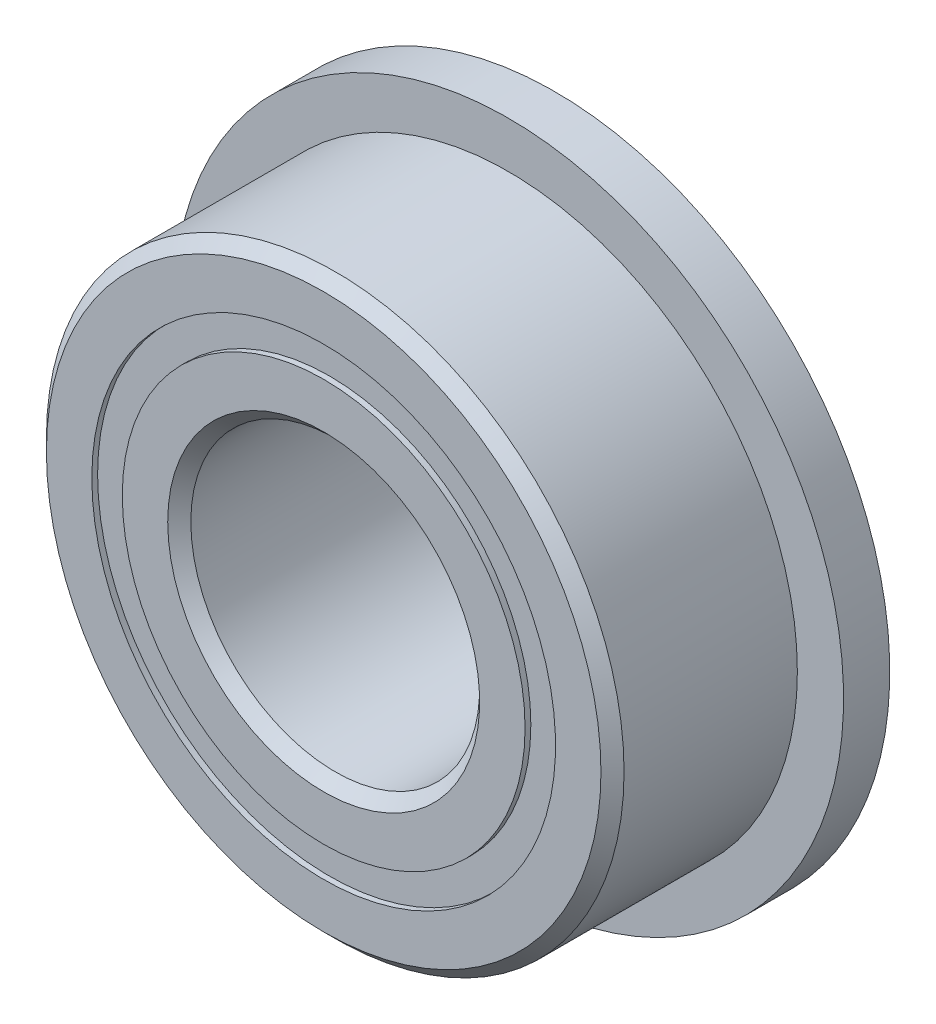
ISO-10303-21;
HEADER;
FILE_DESCRIPTION(('STEP AP214'),'2;1');
FILE_NAME('part.step','',(''),(''),'','','');
FILE_SCHEMA(('AUTOMOTIVE_DESIGN { 1 0 10303 214 1 1 1 1 }'));
ENDSEC;
DATA;
#1=APPLICATION_CONTEXT('core data for automotive mechanical design processes');
#2=APPLICATION_PROTOCOL_DEFINITION('international standard','automotive_design',2000,#1);
#3=PRODUCT_CONTEXT('',#1,'mechanical');
#4=PRODUCT('Part','Part','',(#3));
#5=PRODUCT_RELATED_PRODUCT_CATEGORY('part','',(#4));
#6=PRODUCT_DEFINITION_FORMATION('','',#4);
#7=PRODUCT_DEFINITION_CONTEXT('part definition',#1,'design');
#8=PRODUCT_DEFINITION('design','',#6,#7);
#9=PRODUCT_DEFINITION_SHAPE('','',#8);
#10=(LENGTH_UNIT() NAMED_UNIT(*) SI_UNIT(.MILLI.,.METRE.));
#11=(NAMED_UNIT(*) PLANE_ANGLE_UNIT() SI_UNIT($,.RADIAN.));
#12=(NAMED_UNIT(*) SI_UNIT($,.STERADIAN.) SOLID_ANGLE_UNIT());
#13=UNCERTAINTY_MEASURE_WITH_UNIT(LENGTH_MEASURE(1.E-05),#10,'distance_accuracy_value','');
#14=(GEOMETRIC_REPRESENTATION_CONTEXT(3) GLOBAL_UNCERTAINTY_ASSIGNED_CONTEXT((#13)) GLOBAL_UNIT_ASSIGNED_CONTEXT((#10,
#11,#12)) REPRESENTATION_CONTEXT('',''));
#15=CARTESIAN_POINT('',(0.,0.,0.));
#16=DIRECTION('',(0.,0.,1.));
#17=DIRECTION('',(1.,0.,0.));
#18=AXIS2_PLACEMENT_3D('',#15,#16,#17);
#19=CARTESIAN_POINT('',(0.,4.01373626379225,-1.99999999995271));
#20=DIRECTION('',(0.,0.,-1.));
#21=DIRECTION('',(-1.,0.,0.));
#22=AXIS2_PLACEMENT_3D('',#19,#20,#21);
#23=PLANE('',#22);
#24=CARTESIAN_POINT('',(0.,0.,-1.9999999999527));
#25=DIRECTION('',(0.,0.,-1.));
#26=DIRECTION('',(-1.,0.,0.));
#27=AXIS2_PLACEMENT_3D('',#24,#25,#26);
#28=CIRCLE('',#27,5.80000000019813);
#29=CARTESIAN_POINT('',(-5.80000000019813,0.,-1.9999999999527));
#30=VERTEX_POINT('',#29);
#31=EDGE_CURVE('E12',#30,#30,#28,.T.);
#32=ORIENTED_EDGE('',*,*,#31,.T.);
#33=EDGE_LOOP('',(#32));
#34=FACE_BOUND('',#33,.T.);
#35=CARTESIAN_POINT('',(0.,0.,-1.99999999995271));
#36=DIRECTION('',(0.,0.,-1.));
#37=DIRECTION('',(-1.,0.,0.));
#38=AXIS2_PLACEMENT_3D('',#35,#36,#37);
#39=CIRCLE('',#38,4.01373626379225);
#40=CARTESIAN_POINT('',(-4.01373626379225,0.,-1.99999999995271));
#41=VERTEX_POINT('',#40);
#42=EDGE_CURVE('E118',#41,#41,#39,.T.);
#43=ORIENTED_EDGE('',*,*,#42,.F.);
#44=EDGE_LOOP('',(#43));
#45=FACE_BOUND('',#44,.T.);
#46=ADVANCED_FACE('F45',(#34,#45),#23,.T.);
#47=CARTESIAN_POINT('',(0.,0.,0.));
#48=DIRECTION('',(0.,0.,-1.));
#49=DIRECTION('',(-1.,0.,0.));
#50=AXIS2_PLACEMENT_3D('',#47,#48,#49);
#51=CYLINDRICAL_SURFACE('',#50,5.80000000019813);
#52=CARTESIAN_POINT('',(0.,0.,-1.1999999999724));
#53=DIRECTION('',(0.,0.,-1.));
#54=DIRECTION('',(-1.,0.,0.));
#55=AXIS2_PLACEMENT_3D('',#52,#53,#54);
#56=CIRCLE('',#55,5.80000000019813);
#57=CARTESIAN_POINT('',(-5.80000000019813,0.,-1.1999999999724));
#58=VERTEX_POINT('',#57);
#59=EDGE_CURVE('E53',#58,#58,#56,.T.);
#60=ORIENTED_EDGE('',*,*,#59,.T.);
#61=EDGE_LOOP('',(#60));
#62=FACE_BOUND('',#61,.T.);
#63=ORIENTED_EDGE('',*,*,#31,.F.);
#64=EDGE_LOOP('',(#63));
#65=FACE_BOUND('',#64,.T.);
#66=ADVANCED_FACE('F262',(#62,#65),#51,.T.);
#67=CARTESIAN_POINT('',(0.,5.80000000019813,-1.1999999999724));
#68=DIRECTION('',(0.,0.,1.));
#69=DIRECTION('',(1.,0.,0.));
#70=AXIS2_PLACEMENT_3D('',#67,#68,#69);
#71=PLANE('',#70);
#72=CARTESIAN_POINT('',(0.,0.,-1.1999999999724));
#73=DIRECTION('',(0.,0.,-1.));
#74=DIRECTION('',(-1.,0.,0.));
#75=AXIS2_PLACEMENT_3D('',#72,#73,#74);
#76=CIRCLE('',#75,5.00000000019813);
#77=CARTESIAN_POINT('',(-5.00000000019813,0.,-1.1999999999724));
#78=VERTEX_POINT('',#77);
#79=EDGE_CURVE('E59',#78,#78,#76,.T.);
#80=ORIENTED_EDGE('',*,*,#79,.T.);
#81=EDGE_LOOP('',(#80));
#82=FACE_BOUND('',#81,.T.);
#83=ORIENTED_EDGE('',*,*,#59,.F.);
#84=EDGE_LOOP('',(#83));
#85=FACE_BOUND('',#84,.T.);
#86=ADVANCED_FACE('F259',(#82,#85),#71,.T.);
#87=CARTESIAN_POINT('',(0.,0.,0.));
#88=DIRECTION('',(0.,0.,-1.));
#89=DIRECTION('',(-1.,0.,0.));
#90=AXIS2_PLACEMENT_3D('',#87,#88,#89);
#91=CYLINDRICAL_SURFACE('',#90,5.00000000019813);
#92=CARTESIAN_POINT('',(0.,0.,1.79999999997417));
#93=DIRECTION('',(0.,0.,-1.));
#94=DIRECTION('',(-1.,0.,0.));
#95=AXIS2_PLACEMENT_3D('',#92,#93,#94);
#96=CIRCLE('',#95,5.00000000019813);
#97=CARTESIAN_POINT('',(-5.00000000019813,0.,1.79999999997417));
#98=VERTEX_POINT('',#97);
#99=EDGE_CURVE('E65',#98,#98,#96,.T.);
#100=ORIENTED_EDGE('',*,*,#99,.T.);
#101=EDGE_LOOP('',(#100));
#102=FACE_BOUND('',#101,.T.);
#103=ORIENTED_EDGE('',*,*,#79,.F.);
#104=EDGE_LOOP('',(#103));
#105=FACE_BOUND('',#104,.T.);
#106=ADVANCED_FACE('F255',(#102,#105),#91,.T.);
#107=CARTESIAN_POINT('',(0.,0.,1.79999999997417));
#108=DIRECTION('',(0.,0.,-1.));
#109=DIRECTION('',(-1.,0.,0.));
#110=AXIS2_PLACEMENT_3D('',#107,#108,#109);
#111=CONICAL_SURFACE('',#110,5.00000000019813,0.785398163397455);
#112=CARTESIAN_POINT('',(0.,0.,1.99999999995271));
#113=DIRECTION('',(0.,0.,-1.));
#114=DIRECTION('',(-1.,0.,0.));
#115=AXIS2_PLACEMENT_3D('',#112,#113,#114);
#116=CIRCLE('',#115,4.80000000021959);
#117=CARTESIAN_POINT('',(-4.80000000021959,0.,1.99999999995271));
#118=VERTEX_POINT('',#117);
#119=EDGE_CURVE('E71',#118,#118,#116,.T.);
#120=ORIENTED_EDGE('',*,*,#119,.T.);
#121=EDGE_LOOP('',(#120));
#122=FACE_BOUND('',#121,.T.);
#123=ORIENTED_EDGE('',*,*,#99,.F.);
#124=EDGE_LOOP('',(#123));
#125=FACE_BOUND('',#124,.T.);
#126=ADVANCED_FACE('F251',(#122,#125),#111,.T.);
#127=CARTESIAN_POINT('',(0.,4.80000000021959,1.99999999995271));
#128=DIRECTION('',(0.,0.,1.));
#129=DIRECTION('',(1.,0.,0.));
#130=AXIS2_PLACEMENT_3D('',#127,#128,#129);
#131=PLANE('',#130);
#132=CARTESIAN_POINT('',(0.,0.,1.99999999995271));
#133=DIRECTION('',(0.,0.,-1.));
#134=DIRECTION('',(-1.,0.,0.));
#135=AXIS2_PLACEMENT_3D('',#132,#133,#134);
#136=CIRCLE('',#135,4.01373626379225);
#137=CARTESIAN_POINT('',(-4.01373626379225,0.,1.99999999995271));
#138=VERTEX_POINT('',#137);
#139=EDGE_CURVE('E75',#138,#138,#136,.T.);
#140=ORIENTED_EDGE('',*,*,#139,.T.);
#141=EDGE_LOOP('',(#140));
#142=FACE_BOUND('',#141,.T.);
#143=ORIENTED_EDGE('',*,*,#119,.F.);
#144=EDGE_LOOP('',(#143));
#145=FACE_BOUND('',#144,.T.);
#146=ADVANCED_FACE('F247',(#142,#145),#131,.T.);
#147=CARTESIAN_POINT('',(0.,0.,0.));
#148=DIRECTION('',(0.,0.,-1.));
#149=DIRECTION('',(-1.,0.,0.));
#150=AXIS2_PLACEMENT_3D('',#147,#148,#149);
#151=CYLINDRICAL_SURFACE('',#150,4.01373626379225);
#152=CARTESIAN_POINT('',(0.,0.,1.89999999995271));
#153=DIRECTION('',(0.,0.,-1.));
#154=DIRECTION('',(-1.,0.,0.));
#155=AXIS2_PLACEMENT_3D('',#152,#153,#154);
#156=CIRCLE('',#155,4.01373626379225);
#157=CARTESIAN_POINT('',(-4.01373626379225,0.,1.89999999995271));
#158=VERTEX_POINT('',#157);
#159=EDGE_CURVE('E79',#158,#158,#156,.T.);
#160=ORIENTED_EDGE('',*,*,#159,.T.);
#161=EDGE_LOOP('',(#160));
#162=FACE_BOUND('',#161,.T.);
#163=ORIENTED_EDGE('',*,*,#139,.F.);
#164=EDGE_LOOP('',(#163));
#165=FACE_BOUND('',#164,.T.);
#166=ADVANCED_FACE('F243',(#162,#165),#151,.F.);
#167=CARTESIAN_POINT('',(0.,4.01373626379225,1.89999999995271));
#168=DIRECTION('',(0.,0.,1.));
#169=DIRECTION('',(1.,0.,0.));
#170=AXIS2_PLACEMENT_3D('',#167,#168,#169);
#171=PLANE('',#170);
#172=CARTESIAN_POINT('',(0.,0.,1.89999999995271));
#173=DIRECTION('',(0.,0.,-1.));
#174=DIRECTION('',(-1.,0.,0.));
#175=AXIS2_PLACEMENT_3D('',#172,#173,#174);
#176=CIRCLE('',#175,3.48626373643171);
#177=CARTESIAN_POINT('',(-3.48626373643171,0.,1.89999999995271));
#178=VERTEX_POINT('',#177);
#179=EDGE_CURVE('E83',#178,#178,#176,.T.);
#180=ORIENTED_EDGE('',*,*,#179,.T.);
#181=EDGE_LOOP('',(#180));
#182=FACE_BOUND('',#181,.T.);
#183=ORIENTED_EDGE('',*,*,#159,.F.);
#184=EDGE_LOOP('',(#183));
#185=FACE_BOUND('',#184,.T.);
#186=ADVANCED_FACE('F239',(#182,#185),#171,.T.);
#187=CARTESIAN_POINT('',(0.,0.,0.));
#188=DIRECTION('',(0.,0.,-1.));
#189=DIRECTION('',(-1.,0.,0.));
#190=AXIS2_PLACEMENT_3D('',#187,#188,#189);
#191=CYLINDRICAL_SURFACE('',#190,3.48626373643171);
#192=CARTESIAN_POINT('',(0.,0.,1.99999999995271));
#193=DIRECTION('',(0.,0.,-1.));
#194=DIRECTION('',(-1.,0.,0.));
#195=AXIS2_PLACEMENT_3D('',#192,#193,#194);
#196=CIRCLE('',#195,3.48626373643171);
#197=CARTESIAN_POINT('',(-3.48626373643171,0.,1.99999999995271));
#198=VERTEX_POINT('',#197);
#199=EDGE_CURVE('E87',#198,#198,#196,.T.);
#200=ORIENTED_EDGE('',*,*,#199,.T.);
#201=EDGE_LOOP('',(#200));
#202=FACE_BOUND('',#201,.T.);
#203=ORIENTED_EDGE('',*,*,#179,.F.);
#204=EDGE_LOOP('',(#203));
#205=FACE_BOUND('',#204,.T.);
#206=ADVANCED_FACE('F235',(#202,#205),#191,.T.);
#207=CARTESIAN_POINT('',(0.,3.48626373643171,1.99999999995271));
#208=DIRECTION('',(0.,0.,1.));
#209=DIRECTION('',(1.,0.,0.));
#210=AXIS2_PLACEMENT_3D('',#207,#208,#209);
#211=PLANE('',#210);
#212=CARTESIAN_POINT('',(0.,0.,1.99999999995271));
#213=DIRECTION('',(0.,0.,-1.));
#214=DIRECTION('',(-1.,0.,0.));
#215=AXIS2_PLACEMENT_3D('',#212,#213,#214);
#216=CIRCLE('',#215,2.70000000000437);
#217=CARTESIAN_POINT('',(-2.70000000000437,0.,1.99999999995271));
#218=VERTEX_POINT('',#217);
#219=EDGE_CURVE('E91',#218,#218,#216,.T.);
#220=ORIENTED_EDGE('',*,*,#219,.T.);
#221=EDGE_LOOP('',(#220));
#222=FACE_BOUND('',#221,.T.);
#223=ORIENTED_EDGE('',*,*,#199,.F.);
#224=EDGE_LOOP('',(#223));
#225=FACE_BOUND('',#224,.T.);
#226=ADVANCED_FACE('F231',(#222,#225),#211,.T.);
#227=CARTESIAN_POINT('',(0.,0.,1.99999999995271));
#228=DIRECTION('',(0.,0.,1.));
#229=DIRECTION('',(1.,0.,0.));
#230=AXIS2_PLACEMENT_3D('',#227,#228,#229);
#231=CONICAL_SURFACE('',#230,2.70000000000437,0.785398163397447);
#232=CARTESIAN_POINT('',(0.,0.,1.79999999997417));
#233=DIRECTION('',(0.,0.,-1.));
#234=DIRECTION('',(-1.,0.,0.));
#235=AXIS2_PLACEMENT_3D('',#232,#233,#234);
#236=CIRCLE('',#235,2.50000000002583);
#237=CARTESIAN_POINT('',(-2.50000000002583,0.,1.79999999997417));
#238=VERTEX_POINT('',#237);
#239=EDGE_CURVE('E95',#238,#238,#236,.T.);
#240=ORIENTED_EDGE('',*,*,#239,.T.);
#241=EDGE_LOOP('',(#240));
#242=FACE_BOUND('',#241,.T.);
#243=ORIENTED_EDGE('',*,*,#219,.F.);
#244=EDGE_LOOP('',(#243));
#245=FACE_BOUND('',#244,.T.);
#246=ADVANCED_FACE('F227',(#242,#245),#231,.F.);
#247=CARTESIAN_POINT('',(0.,0.,0.));
#248=DIRECTION('',(0.,0.,-1.));
#249=DIRECTION('',(-1.,0.,0.));
#250=AXIS2_PLACEMENT_3D('',#247,#248,#249);
#251=CYLINDRICAL_SURFACE('',#250,2.50000000002583);
#252=CARTESIAN_POINT('',(0.,0.,-1.79999999997417));
#253=DIRECTION('',(0.,0.,-1.));
#254=DIRECTION('',(-1.,0.,0.));
#255=AXIS2_PLACEMENT_3D('',#252,#253,#254);
#256=CIRCLE('',#255,2.50000000002583);
#257=CARTESIAN_POINT('',(-2.50000000002583,0.,-1.79999999997417));
#258=VERTEX_POINT('',#257);
#259=EDGE_CURVE('E99',#258,#258,#256,.T.);
#260=ORIENTED_EDGE('',*,*,#259,.T.);
#261=EDGE_LOOP('',(#260));
#262=FACE_BOUND('',#261,.T.);
#263=ORIENTED_EDGE('',*,*,#239,.F.);
#264=EDGE_LOOP('',(#263));
#265=FACE_BOUND('',#264,.T.);
#266=ADVANCED_FACE('F223',(#262,#265),#251,.F.);
#267=CARTESIAN_POINT('',(0.,0.,-1.79999999997417));
#268=DIRECTION('',(0.,0.,-1.));
#269=DIRECTION('',(-1.,0.,0.));
#270=AXIS2_PLACEMENT_3D('',#267,#268,#269);
#271=CONICAL_SURFACE('',#270,2.50000000002583,0.785398163397449);
#272=CARTESIAN_POINT('',(0.,0.,-1.99999999995271));
#273=DIRECTION('',(0.,0.,-1.));
#274=DIRECTION('',(-1.,0.,0.));
#275=AXIS2_PLACEMENT_3D('',#272,#273,#274);
#276=CIRCLE('',#275,2.70000000000437);
#277=CARTESIAN_POINT('',(-2.70000000000437,0.,-1.99999999995271));
#278=VERTEX_POINT('',#277);
#279=EDGE_CURVE('E103',#278,#278,#276,.T.);
#280=ORIENTED_EDGE('',*,*,#279,.T.);
#281=EDGE_LOOP('',(#280));
#282=FACE_BOUND('',#281,.T.);
#283=ORIENTED_EDGE('',*,*,#259,.F.);
#284=EDGE_LOOP('',(#283));
#285=FACE_BOUND('',#284,.T.);
#286=ADVANCED_FACE('F219',(#282,#285),#271,.F.);
#287=CARTESIAN_POINT('',(0.,2.70000000000437,-1.99999999995271));
#288=DIRECTION('',(0.,0.,-1.));
#289=DIRECTION('',(-1.,0.,0.));
#290=AXIS2_PLACEMENT_3D('',#287,#288,#289);
#291=PLANE('',#290);
#292=CARTESIAN_POINT('',(0.,0.,-1.99999999995271));
#293=DIRECTION('',(0.,0.,-1.));
#294=DIRECTION('',(-1.,0.,0.));
#295=AXIS2_PLACEMENT_3D('',#292,#293,#294);
#296=CIRCLE('',#295,3.48626373643171);
#297=CARTESIAN_POINT('',(-3.48626373643171,0.,-1.99999999995271));
#298=VERTEX_POINT('',#297);
#299=EDGE_CURVE('E106',#298,#298,#296,.T.);
#300=ORIENTED_EDGE('',*,*,#299,.T.);
#301=EDGE_LOOP('',(#300));
#302=FACE_BOUND('',#301,.T.);
#303=ORIENTED_EDGE('',*,*,#279,.F.);
#304=EDGE_LOOP('',(#303));
#305=FACE_BOUND('',#304,.T.);
#306=ADVANCED_FACE('F215',(#302,#305),#291,.T.);
#307=CARTESIAN_POINT('',(0.,0.,0.));
#308=DIRECTION('',(0.,0.,-1.));
#309=DIRECTION('',(-1.,0.,0.));
#310=AXIS2_PLACEMENT_3D('',#307,#308,#309);
#311=CYLINDRICAL_SURFACE('',#310,3.48626373643171);
#312=CARTESIAN_POINT('',(0.,0.,-1.89999999995271));
#313=DIRECTION('',(0.,0.,-1.));
#314=DIRECTION('',(-1.,0.,0.));
#315=AXIS2_PLACEMENT_3D('',#312,#313,#314);
#316=CIRCLE('',#315,3.48626373643171);
#317=CARTESIAN_POINT('',(-3.48626373643171,0.,-1.89999999995271));
#318=VERTEX_POINT('',#317);
#319=EDGE_CURVE('E110',#318,#318,#316,.T.);
#320=ORIENTED_EDGE('',*,*,#319,.T.);
#321=EDGE_LOOP('',(#320));
#322=FACE_BOUND('',#321,.T.);
#323=ORIENTED_EDGE('',*,*,#299,.F.);
#324=EDGE_LOOP('',(#323));
#325=FACE_BOUND('',#324,.T.);
#326=ADVANCED_FACE('F211',(#322,#325),#311,.T.);
#327=CARTESIAN_POINT('',(0.,3.48626373643171,-1.89999999995271));
#328=DIRECTION('',(0.,0.,-1.));
#329=DIRECTION('',(-1.,0.,0.));
#330=AXIS2_PLACEMENT_3D('',#327,#328,#329);
#331=PLANE('',#330);
#332=CARTESIAN_POINT('',(0.,0.,-1.89999999995271));
#333=DIRECTION('',(0.,0.,-1.));
#334=DIRECTION('',(-1.,0.,0.));
#335=AXIS2_PLACEMENT_3D('',#332,#333,#334);
#336=CIRCLE('',#335,4.01373626379225);
#337=CARTESIAN_POINT('',(-4.01373626379225,0.,-1.89999999995271));
#338=VERTEX_POINT('',#337);
#339=EDGE_CURVE('E114',#338,#338,#336,.T.);
#340=ORIENTED_EDGE('',*,*,#339,.T.);
#341=EDGE_LOOP('',(#340));
#342=FACE_BOUND('',#341,.T.);
#343=ORIENTED_EDGE('',*,*,#319,.F.);
#344=EDGE_LOOP('',(#343));
#345=FACE_BOUND('',#344,.T.);
#346=ADVANCED_FACE('F207',(#342,#345),#331,.T.);
#347=CARTESIAN_POINT('',(0.,0.,0.));
#348=DIRECTION('',(0.,0.,-1.));
#349=DIRECTION('',(-1.,0.,0.));
#350=AXIS2_PLACEMENT_3D('',#347,#348,#349);
#351=CYLINDRICAL_SURFACE('',#350,4.01373626379225);
#352=ORIENTED_EDGE('',*,*,#42,.T.);
#353=EDGE_LOOP('',(#352));
#354=FACE_BOUND('',#353,.T.);
#355=ORIENTED_EDGE('',*,*,#339,.F.);
#356=EDGE_LOOP('',(#355));
#357=FACE_BOUND('',#356,.T.);
#358=ADVANCED_FACE('F204',(#354,#357),#351,.F.);
#359=CLOSED_SHELL('',(#46,#66,#86,#106,#126,#146,#166,#186,#206,#226,#246,#266,#286,#306,#326,
#346,#358));
#360=CARTESIAN_POINT('',(0.,4.01373626379225,0.927189448602436));
#361=DIRECTION('',(0.,0.,1.));
#362=DIRECTION('',(1.,0.,0.));
#363=AXIS2_PLACEMENT_3D('',#360,#361,#362);
#364=PLANE('',#363);
#365=CARTESIAN_POINT('',(0.,0.,0.927189448602436));
#366=DIRECTION('',(0.,0.,-1.));
#367=DIRECTION('',(-1.,0.,0.));
#368=AXIS2_PLACEMENT_3D('',#365,#366,#367);
#369=CIRCLE('',#368,3.48626373643171);
#370=CARTESIAN_POINT('',(-3.48626373643171,0.,0.927189448602436));
#371=VERTEX_POINT('',#370);
#372=EDGE_CURVE('E149',#371,#371,#369,.T.);
#373=ORIENTED_EDGE('',*,*,#372,.F.);
#374=EDGE_LOOP('',(#373));
#375=FACE_BOUND('',#374,.T.);
#376=CARTESIAN_POINT('',(0.,0.,0.927189448602436));
#377=DIRECTION('',(0.,0.,-1.));
#378=DIRECTION('',(-1.,0.,0.));
#379=AXIS2_PLACEMENT_3D('',#376,#377,#378);
#380=CIRCLE('',#379,4.01373626379225);
#381=CARTESIAN_POINT('',(-4.01373626379225,0.,0.927189448602436));
#382=VERTEX_POINT('',#381);
#383=EDGE_CURVE('E122',#382,#382,#380,.T.);
#384=ORIENTED_EDGE('',*,*,#383,.T.);
#385=EDGE_LOOP('',(#384));
#386=FACE_BOUND('',#385,.T.);
#387=ADVANCED_FACE('F156',(#375,#386),#364,.F.);
#388=CARTESIAN_POINT('',(0.,0.,0.));
#389=DIRECTION('',(0.,0.,-1.));
#390=DIRECTION('',(-1.,0.,0.));
#391=AXIS2_PLACEMENT_3D('',#388,#389,#390);
#392=CYLINDRICAL_SURFACE('',#391,4.01373626379225);
#393=ORIENTED_EDGE('',*,*,#383,.F.);
#394=EDGE_LOOP('',(#393));
#395=FACE_BOUND('',#394,.T.);
#396=CARTESIAN_POINT('',(0.,0.,0.888888888905503));
#397=DIRECTION('',(0.,0.,-1.));
#398=DIRECTION('',(-1.,0.,0.));
#399=AXIS2_PLACEMENT_3D('',#396,#397,#398);
#400=CIRCLE('',#399,4.01373626379225);
#401=CARTESIAN_POINT('',(-4.01373626379225,0.,0.888888888905503));
#402=VERTEX_POINT('',#401);
#403=EDGE_CURVE('E126',#402,#402,#400,.T.);
#404=ORIENTED_EDGE('',*,*,#403,.T.);
#405=EDGE_LOOP('',(#404));
#406=FACE_BOUND('',#405,.T.);
#407=ADVANCED_FACE('F159',(#395,#406),#392,.F.);
#408=CARTESIAN_POINT('',(0.,0.,0.));
#409=DIRECTION('',(0.,0.,-1.));
#410=DIRECTION('',(-1.,0.,0.));
#411=AXIS2_PLACEMENT_3D('',#408,#409,#410);
#412=TOROIDAL_SURFACE('',#411,3.75000000011198,0.927189448602436);
#413=ORIENTED_EDGE('',*,*,#403,.F.);
#414=EDGE_LOOP('',(#413));
#415=FACE_BOUND('',#414,.T.);
#416=CARTESIAN_POINT('',(0.,0.,-0.888888888905503));
#417=DIRECTION('',(0.,0.,-1.));
#418=DIRECTION('',(-1.,0.,0.));
#419=AXIS2_PLACEMENT_3D('',#416,#417,#418);
#420=CIRCLE('',#419,4.01373626379225);
#421=CARTESIAN_POINT('',(-4.01373626379225,0.,-0.888888888905503));
#422=VERTEX_POINT('',#421);
#423=EDGE_CURVE('E130',#422,#422,#420,.T.);
#424=ORIENTED_EDGE('',*,*,#423,.T.);
#425=EDGE_LOOP('',(#424));
#426=FACE_BOUND('',#425,.T.);
#427=ADVANCED_FACE('F166',(#415,#426),#412,.F.);
#428=CARTESIAN_POINT('',(0.,0.,0.));
#429=DIRECTION('',(0.,0.,-1.));
#430=DIRECTION('',(-1.,0.,0.));
#431=AXIS2_PLACEMENT_3D('',#428,#429,#430);
#432=CYLINDRICAL_SURFACE('',#431,4.01373626379225);
#433=ORIENTED_EDGE('',*,*,#423,.F.);
#434=EDGE_LOOP('',(#433));
#435=FACE_BOUND('',#434,.T.);
#436=CARTESIAN_POINT('',(0.,0.,-0.927189448602435));
#437=DIRECTION('',(0.,0.,-1.));
#438=DIRECTION('',(-1.,0.,0.));
#439=AXIS2_PLACEMENT_3D('',#436,#437,#438);
#440=CIRCLE('',#439,4.01373626379225);
#441=CARTESIAN_POINT('',(-4.01373626379225,0.,-0.927189448602435));
#442=VERTEX_POINT('',#441);
#443=EDGE_CURVE('E133',#442,#442,#440,.T.);
#444=ORIENTED_EDGE('',*,*,#443,.T.);
#445=EDGE_LOOP('',(#444));
#446=FACE_BOUND('',#445,.T.);
#447=ADVANCED_FACE('F172',(#435,#446),#432,.F.);
#448=CARTESIAN_POINT('',(0.,3.48626373643171,-0.927189448602435));
#449=DIRECTION('',(0.,0.,-1.));
#450=DIRECTION('',(-1.,0.,0.));
#451=AXIS2_PLACEMENT_3D('',#448,#449,#450);
#452=PLANE('',#451);
#453=ORIENTED_EDGE('',*,*,#443,.F.);
#454=EDGE_LOOP('',(#453));
#455=FACE_BOUND('',#454,.T.);
#456=CARTESIAN_POINT('',(0.,0.,-0.927189448602435));
#457=DIRECTION('',(0.,0.,-1.));
#458=DIRECTION('',(-1.,0.,0.));
#459=AXIS2_PLACEMENT_3D('',#456,#457,#458);
#460=CIRCLE('',#459,3.48626373643171);
#461=CARTESIAN_POINT('',(-3.48626373643171,0.,-0.927189448602435));
#462=VERTEX_POINT('',#461);
#463=EDGE_CURVE('E137',#462,#462,#460,.T.);
#464=ORIENTED_EDGE('',*,*,#463,.T.);
#465=EDGE_LOOP('',(#464));
#466=FACE_BOUND('',#465,.T.);
#467=ADVANCED_FACE('F178',(#455,#466),#452,.F.);
#468=CARTESIAN_POINT('',(0.,0.,0.));
#469=DIRECTION('',(0.,0.,-1.));
#470=DIRECTION('',(-1.,0.,0.));
#471=AXIS2_PLACEMENT_3D('',#468,#469,#470);
#472=CYLINDRICAL_SURFACE('',#471,3.48626373643171);
#473=ORIENTED_EDGE('',*,*,#463,.F.);
#474=EDGE_LOOP('',(#473));
#475=FACE_BOUND('',#474,.T.);
#476=CARTESIAN_POINT('',(0.,0.,-0.888888888905502));
#477=DIRECTION('',(0.,0.,-1.));
#478=DIRECTION('',(-1.,0.,0.));
#479=AXIS2_PLACEMENT_3D('',#476,#477,#478);
#480=CIRCLE('',#479,3.48626373643171);
#481=CARTESIAN_POINT('',(-3.48626373643171,0.,-0.888888888905502));
#482=VERTEX_POINT('',#481);
#483=EDGE_CURVE('E141',#482,#482,#480,.T.);
#484=ORIENTED_EDGE('',*,*,#483,.T.);
#485=EDGE_LOOP('',(#484));
#486=FACE_BOUND('',#485,.T.);
#487=ADVANCED_FACE('F184',(#475,#486),#472,.T.);
#488=CARTESIAN_POINT('',(0.,0.,0.));
#489=DIRECTION('',(0.,0.,-1.));
#490=DIRECTION('',(-1.,0.,0.));
#491=AXIS2_PLACEMENT_3D('',#488,#489,#490);
#492=TOROIDAL_SURFACE('',#491,3.75000000011198,0.927189448602436);
#493=ORIENTED_EDGE('',*,*,#483,.F.);
#494=EDGE_LOOP('',(#493));
#495=FACE_BOUND('',#494,.T.);
#496=CARTESIAN_POINT('',(0.,0.,0.888888888905503));
#497=DIRECTION('',(0.,0.,-1.));
#498=DIRECTION('',(-1.,0.,0.));
#499=AXIS2_PLACEMENT_3D('',#496,#497,#498);
#500=CIRCLE('',#499,3.48626373643171);
#501=CARTESIAN_POINT('',(-3.48626373643171,0.,0.888888888905503));
#502=VERTEX_POINT('',#501);
#503=EDGE_CURVE('E145',#502,#502,#500,.T.);
#504=ORIENTED_EDGE('',*,*,#503,.T.);
#505=EDGE_LOOP('',(#504));
#506=FACE_BOUND('',#505,.T.);
#507=ADVANCED_FACE('F190',(#495,#506),#492,.F.);
#508=CARTESIAN_POINT('',(0.,0.,0.));
#509=DIRECTION('',(0.,0.,-1.));
#510=DIRECTION('',(-1.,0.,0.));
#511=AXIS2_PLACEMENT_3D('',#508,#509,#510);
#512=CYLINDRICAL_SURFACE('',#511,3.48626373643171);
#513=ORIENTED_EDGE('',*,*,#503,.F.);
#514=EDGE_LOOP('',(#513));
#515=FACE_BOUND('',#514,.T.);
#516=ORIENTED_EDGE('',*,*,#372,.T.);
#517=EDGE_LOOP('',(#516));
#518=FACE_BOUND('',#517,.T.);
#519=ADVANCED_FACE('F154',(#515,#518),#512,.T.);
#520=CLOSED_SHELL('',(#387,#407,#427,#447,#467,#487,#507,#519));
#521=ORIENTED_CLOSED_SHELL('',*,#520,.T.);
#522=BREP_WITH_VOIDS('B2',#359,(#521));
#523=ADVANCED_BREP_SHAPE_REPRESENTATION('',(#18,#522),#14);
#524=SHAPE_DEFINITION_REPRESENTATION(#9,#523);
ENDSEC;
END-ISO-10303-21;
